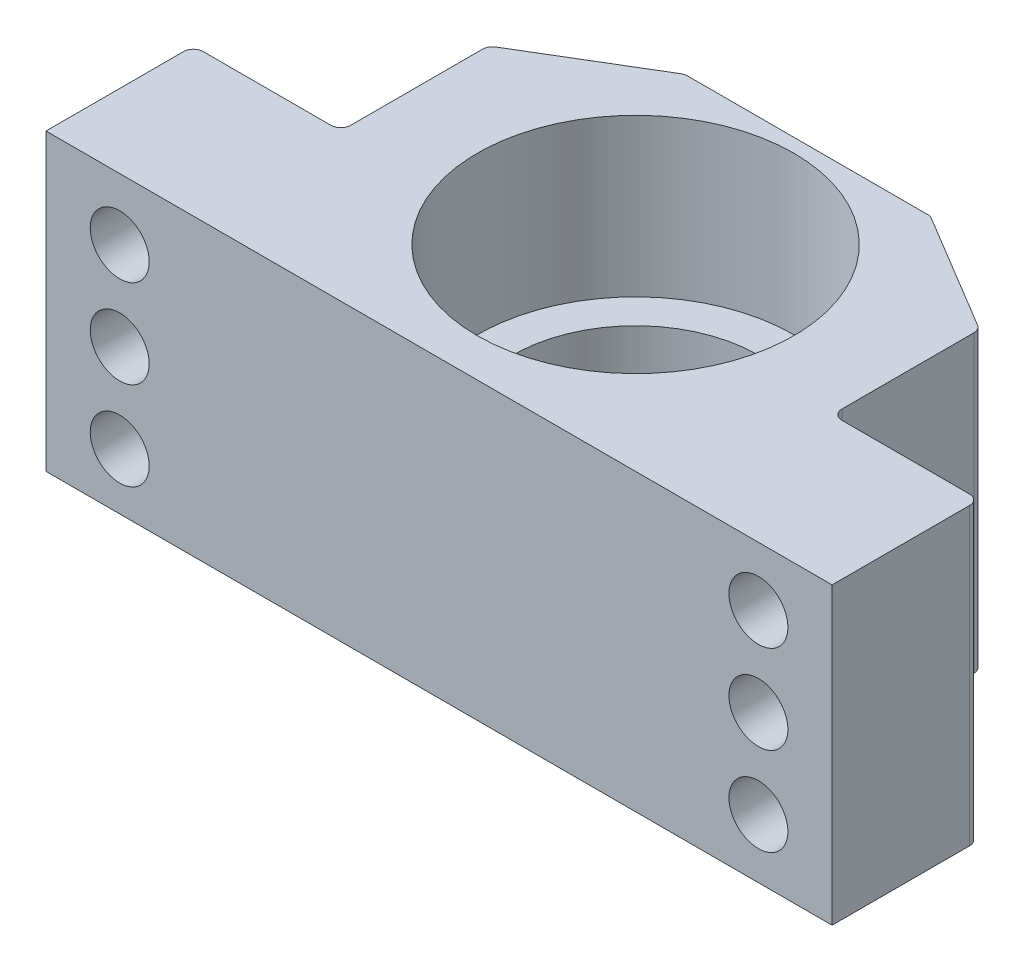
ISO-10303-21;
HEADER;
FILE_DESCRIPTION(('STEP AP214'),'2;1');
FILE_NAME('part.step','',(''),(''),'','','');
FILE_SCHEMA(('AUTOMOTIVE_DESIGN { 1 0 10303 214 1 1 1 1 }'));
ENDSEC;
DATA;
#1=APPLICATION_CONTEXT('core data for automotive mechanical design processes');
#2=APPLICATION_PROTOCOL_DEFINITION('international standard','automotive_design',2000,#1);
#3=PRODUCT_CONTEXT('',#1,'mechanical');
#4=PRODUCT('Part','Part','',(#3));
#5=PRODUCT_RELATED_PRODUCT_CATEGORY('part','',(#4));
#6=PRODUCT_DEFINITION_FORMATION('','',#4);
#7=PRODUCT_DEFINITION_CONTEXT('part definition',#1,'design');
#8=PRODUCT_DEFINITION('design','',#6,#7);
#9=PRODUCT_DEFINITION_SHAPE('','',#8);
#10=(LENGTH_UNIT() NAMED_UNIT(*) SI_UNIT(.MILLI.,.METRE.));
#11=(NAMED_UNIT(*) PLANE_ANGLE_UNIT() SI_UNIT($,.RADIAN.));
#12=(NAMED_UNIT(*) SI_UNIT($,.STERADIAN.) SOLID_ANGLE_UNIT());
#13=UNCERTAINTY_MEASURE_WITH_UNIT(LENGTH_MEASURE(1.E-05),#10,'distance_accuracy_value','');
#14=(GEOMETRIC_REPRESENTATION_CONTEXT(3) GLOBAL_UNCERTAINTY_ASSIGNED_CONTEXT((#13)) GLOBAL_UNIT_ASSIGNED_CONTEXT((#10,
#11,#12)) REPRESENTATION_CONTEXT('',''));
#15=CARTESIAN_POINT('',(0.,0.,0.));
#16=DIRECTION('',(0.,0.,1.));
#17=DIRECTION('',(1.,0.,0.));
#18=AXIS2_PLACEMENT_3D('',#15,#16,#17);
#19=CARTESIAN_POINT('',(0.,30.,0.));
#20=DIRECTION('',(0.,0.,-1.));
#21=DIRECTION('',(-1.,0.,0.));
#22=AXIS2_PLACEMENT_3D('',#19,#20,#21);
#23=PLANE('',#22);
#24=CARTESIAN_POINT('',(-32.5,5.72166377966386,0.));
#25=DIRECTION('',(0.,0.,-1.));
#26=DIRECTION('',(-1.,0.,0.));
#27=AXIS2_PLACEMENT_3D('',#24,#25,#26);
#28=CIRCLE('',#27,3.);
#29=CARTESIAN_POINT('',(-35.5,5.72166377966386,0.));
#30=VERTEX_POINT('',#29);
#31=EDGE_CURVE('E321',#30,#30,#28,.T.);
#32=ORIENTED_EDGE('',*,*,#31,.T.);
#33=EDGE_LOOP('',(#32));
#34=FACE_BOUND('',#33,.T.);
#35=CARTESIAN_POINT('',(-32.5,14.7216637796639,0.));
#36=DIRECTION('',(0.,0.,-1.));
#37=DIRECTION('',(-1.,0.,0.));
#38=AXIS2_PLACEMENT_3D('',#35,#36,#37);
#39=CIRCLE('',#38,3.);
#40=CARTESIAN_POINT('',(-35.5,14.7216637796639,0.));
#41=VERTEX_POINT('',#40);
#42=EDGE_CURVE('E327',#41,#41,#39,.T.);
#43=ORIENTED_EDGE('',*,*,#42,.T.);
#44=EDGE_LOOP('',(#43));
#45=FACE_BOUND('',#44,.T.);
#46=CARTESIAN_POINT('',(-32.5,23.7216637796639,0.));
#47=DIRECTION('',(0.,0.,-1.));
#48=DIRECTION('',(-1.,0.,0.));
#49=AXIS2_PLACEMENT_3D('',#46,#47,#48);
#50=CIRCLE('',#49,3.);
#51=CARTESIAN_POINT('',(-35.5,23.7216637796639,0.));
#52=VERTEX_POINT('',#51);
#53=EDGE_CURVE('E333',#52,#52,#50,.T.);
#54=ORIENTED_EDGE('',*,*,#53,.T.);
#55=EDGE_LOOP('',(#54));
#56=FACE_BOUND('',#55,.T.);
#57=CARTESIAN_POINT('',(32.5,24.,0.));
#58=DIRECTION('',(0.,0.,-1.));
#59=DIRECTION('',(-1.,0.,0.));
#60=AXIS2_PLACEMENT_3D('',#57,#58,#59);
#61=CIRCLE('',#60,3.);
#62=CARTESIAN_POINT('',(29.5,24.,0.));
#63=VERTEX_POINT('',#62);
#64=EDGE_CURVE('E339',#63,#63,#61,.T.);
#65=ORIENTED_EDGE('',*,*,#64,.T.);
#66=EDGE_LOOP('',(#65));
#67=FACE_BOUND('',#66,.T.);
#68=CARTESIAN_POINT('',(32.5,15.,0.));
#69=DIRECTION('',(0.,0.,-1.));
#70=DIRECTION('',(-1.,0.,0.));
#71=AXIS2_PLACEMENT_3D('',#68,#69,#70);
#72=CIRCLE('',#71,3.);
#73=CARTESIAN_POINT('',(29.5,15.,0.));
#74=VERTEX_POINT('',#73);
#75=EDGE_CURVE('E345',#74,#74,#72,.T.);
#76=ORIENTED_EDGE('',*,*,#75,.T.);
#77=EDGE_LOOP('',(#76));
#78=FACE_BOUND('',#77,.T.);
#79=CARTESIAN_POINT('',(32.5,6.,0.));
#80=DIRECTION('',(0.,0.,-1.));
#81=DIRECTION('',(-1.,0.,0.));
#82=AXIS2_PLACEMENT_3D('',#79,#80,#81);
#83=CIRCLE('',#82,3.);
#84=CARTESIAN_POINT('',(29.5,6.,0.));
#85=VERTEX_POINT('',#84);
#86=EDGE_CURVE('E351',#85,#85,#83,.T.);
#87=ORIENTED_EDGE('',*,*,#86,.T.);
#88=EDGE_LOOP('',(#87));
#89=FACE_BOUND('',#88,.T.);
#90=DIRECTION('',(1.,0.,0.));
#91=VECTOR('',#90,1.);
#92=CARTESIAN_POINT('',(0.,0.,0.));
#93=LINE('',#92,#91);
#94=CARTESIAN_POINT('',(-40.,0.,0.));
#95=VERTEX_POINT('',#94);
#96=CARTESIAN_POINT('',(40.,0.,0.));
#97=VERTEX_POINT('',#96);
#98=EDGE_CURVE('E174',#95,#97,#93,.T.);
#99=ORIENTED_EDGE('',*,*,#98,.T.);
#100=DIRECTION('',(0.,-1.,0.));
#101=VECTOR('',#100,1.);
#102=CARTESIAN_POINT('',(40.,30.,0.));
#103=LINE('',#102,#101);
#104=CARTESIAN_POINT('',(40.,30.,0.));
#105=VERTEX_POINT('',#104);
#106=EDGE_CURVE('E172',#105,#97,#103,.T.);
#107=ORIENTED_EDGE('',*,*,#106,.F.);
#108=DIRECTION('',(1.,0.,0.));
#109=VECTOR('',#108,1.);
#110=CARTESIAN_POINT('',(0.,30.,0.));
#111=LINE('',#110,#109);
#112=CARTESIAN_POINT('',(-40.,30.,0.));
#113=VERTEX_POINT('',#112);
#114=EDGE_CURVE('E157',#113,#105,#111,.T.);
#115=ORIENTED_EDGE('',*,*,#114,.F.);
#116=DIRECTION('',(0.,-1.,0.));
#117=VECTOR('',#116,1.);
#118=CARTESIAN_POINT('',(-40.,30.,0.));
#119=LINE('',#118,#117);
#120=EDGE_CURVE('E179',#113,#95,#119,.T.);
#121=ORIENTED_EDGE('',*,*,#120,.T.);
#122=EDGE_LOOP('',(#99,#107,#115,#121));
#123=FACE_BOUND('',#122,.T.);
#124=ADVANCED_FACE('F32',(#34,#45,#56,#67,#78,#89,#123),#23,.F.);
#125=CARTESIAN_POINT('',(40.,30.,0.));
#126=DIRECTION('',(-1.,0.,0.));
#127=DIRECTION('',(0.,0.,1.));
#128=AXIS2_PLACEMENT_3D('',#125,#126,#127);
#129=PLANE('',#128);
#130=DIRECTION('',(0.,0.,-1.));
#131=VECTOR('',#130,1.);
#132=CARTESIAN_POINT('',(40.,0.,0.));
#133=LINE('',#132,#131);
#134=CARTESIAN_POINT('',(40.,0.,-14.));
#135=VERTEX_POINT('',#134);
#136=EDGE_CURVE('E197',#97,#135,#133,.T.);
#137=ORIENTED_EDGE('',*,*,#136,.T.);
#138=DIRECTION('',(0.,-1.,0.));
#139=VECTOR('',#138,1.);
#140=CARTESIAN_POINT('',(40.,30.,-14.));
#141=LINE('',#140,#139);
#142=CARTESIAN_POINT('',(40.,30.,-14.));
#143=VERTEX_POINT('',#142);
#144=EDGE_CURVE('E183',#135,#143,#141,.F.);
#145=ORIENTED_EDGE('',*,*,#144,.T.);
#146=DIRECTION('',(0.,0.,-1.));
#147=VECTOR('',#146,1.);
#148=CARTESIAN_POINT('',(40.,30.,0.));
#149=LINE('',#148,#147);
#150=EDGE_CURVE('E162',#105,#143,#149,.T.);
#151=ORIENTED_EDGE('',*,*,#150,.F.);
#152=ORIENTED_EDGE('',*,*,#106,.T.);
#153=EDGE_LOOP('',(#137,#145,#151,#152));
#154=FACE_BOUND('',#153,.T.);
#155=ADVANCED_FACE('F181',(#154),#129,.F.);
#156=CARTESIAN_POINT('',(40.,30.,-15.));
#157=DIRECTION('',(0.,0.,1.));
#158=DIRECTION('',(1.,0.,0.));
#159=AXIS2_PLACEMENT_3D('',#156,#157,#158);
#160=PLANE('',#159);
#161=CARTESIAN_POINT('',(32.5,24.,-15.));
#162=DIRECTION('',(0.,0.,-1.));
#163=DIRECTION('',(-1.,0.,0.));
#164=AXIS2_PLACEMENT_3D('',#161,#162,#163);
#165=CIRCLE('',#164,3.);
#166=CARTESIAN_POINT('',(29.5,24.,-15.));
#167=VERTEX_POINT('',#166);
#168=EDGE_CURVE('E336',#167,#167,#165,.T.);
#169=ORIENTED_EDGE('',*,*,#168,.F.);
#170=EDGE_LOOP('',(#169));
#171=FACE_BOUND('',#170,.T.);
#172=CARTESIAN_POINT('',(32.5,15.,-15.));
#173=DIRECTION('',(0.,0.,-1.));
#174=DIRECTION('',(-1.,0.,0.));
#175=AXIS2_PLACEMENT_3D('',#172,#173,#174);
#176=CIRCLE('',#175,3.);
#177=CARTESIAN_POINT('',(29.5,15.,-15.));
#178=VERTEX_POINT('',#177);
#179=EDGE_CURVE('E342',#178,#178,#176,.T.);
#180=ORIENTED_EDGE('',*,*,#179,.F.);
#181=EDGE_LOOP('',(#180));
#182=FACE_BOUND('',#181,.T.);
#183=CARTESIAN_POINT('',(32.5,6.,-15.));
#184=DIRECTION('',(0.,0.,-1.));
#185=DIRECTION('',(-1.,0.,0.));
#186=AXIS2_PLACEMENT_3D('',#183,#184,#185);
#187=CIRCLE('',#186,3.);
#188=CARTESIAN_POINT('',(29.5,6.,-15.));
#189=VERTEX_POINT('',#188);
#190=EDGE_CURVE('E348',#189,#189,#187,.T.);
#191=ORIENTED_EDGE('',*,*,#190,.F.);
#192=EDGE_LOOP('',(#191));
#193=FACE_BOUND('',#192,.T.);
#194=DIRECTION('',(-1.,0.,0.));
#195=VECTOR('',#194,1.);
#196=CARTESIAN_POINT('',(40.,30.,-15.));
#197=LINE('',#196,#195);
#198=CARTESIAN_POINT('',(39.,30.,-15.));
#199=VERTEX_POINT('',#198);
#200=CARTESIAN_POINT('',(26.,30.,-15.));
#201=VERTEX_POINT('',#200);
#202=EDGE_CURVE('E184',#199,#201,#197,.T.);
#203=ORIENTED_EDGE('',*,*,#202,.F.);
#204=DIRECTION('',(0.,-1.,0.));
#205=VECTOR('',#204,1.);
#206=CARTESIAN_POINT('',(39.,30.,-15.));
#207=LINE('',#206,#205);
#208=CARTESIAN_POINT('',(39.,0.,-15.));
#209=VERTEX_POINT('',#208);
#210=EDGE_CURVE('E253',#199,#209,#207,.T.);
#211=ORIENTED_EDGE('',*,*,#210,.T.);
#212=DIRECTION('',(-1.,0.,0.));
#213=VECTOR('',#212,1.);
#214=CARTESIAN_POINT('',(40.,0.,-15.));
#215=LINE('',#214,#213);
#216=CARTESIAN_POINT('',(26.,0.,-15.));
#217=VERTEX_POINT('',#216);
#218=EDGE_CURVE('E200',#209,#217,#215,.T.);
#219=ORIENTED_EDGE('',*,*,#218,.T.);
#220=DIRECTION('',(0.,-1.,0.));
#221=VECTOR('',#220,1.);
#222=CARTESIAN_POINT('',(26.,30.,-15.));
#223=LINE('',#222,#221);
#224=EDGE_CURVE('E251',#217,#201,#223,.F.);
#225=ORIENTED_EDGE('',*,*,#224,.T.);
#226=EDGE_LOOP('',(#203,#211,#219,#225));
#227=FACE_BOUND('',#226,.T.);
#228=ADVANCED_FACE('F289',(#171,#182,#193,#227),#160,.F.);
#229=CARTESIAN_POINT('',(25.,30.,-15.));
#230=DIRECTION('',(-1.,0.,0.));
#231=DIRECTION('',(0.,0.,1.));
#232=AXIS2_PLACEMENT_3D('',#229,#230,#231);
#233=PLANE('',#232);
#234=DIRECTION('',(0.,0.,-1.));
#235=VECTOR('',#234,1.);
#236=CARTESIAN_POINT('',(25.,30.,-15.));
#237=LINE('',#236,#235);
#238=CARTESIAN_POINT('',(25.,30.,-16.));
#239=VERTEX_POINT('',#238);
#240=CARTESIAN_POINT('',(25.,30.,-29.4338096210309));
#241=VERTEX_POINT('',#240);
#242=EDGE_CURVE('E186',#239,#241,#237,.T.);
#243=ORIENTED_EDGE('',*,*,#242,.F.);
#244=DIRECTION('',(0.,-1.,0.));
#245=VECTOR('',#244,1.);
#246=CARTESIAN_POINT('',(25.,0.,-16.));
#247=LINE('',#246,#245);
#248=CARTESIAN_POINT('',(25.,0.,-16.));
#249=VERTEX_POINT('',#248);
#250=EDGE_CURVE('E259',#239,#249,#247,.T.);
#251=ORIENTED_EDGE('',*,*,#250,.T.);
#252=DIRECTION('',(0.,0.,-1.));
#253=VECTOR('',#252,1.);
#254=CARTESIAN_POINT('',(25.,0.,-15.));
#255=LINE('',#254,#253);
#256=CARTESIAN_POINT('',(25.,0.,-29.4338096210309));
#257=VERTEX_POINT('',#256);
#258=EDGE_CURVE('E203',#249,#257,#255,.T.);
#259=ORIENTED_EDGE('',*,*,#258,.T.);
#260=DIRECTION('',(0.,1.,0.));
#261=VECTOR('',#260,1.);
#262=CARTESIAN_POINT('',(25.,30.,-29.4338096210309));
#263=LINE('',#262,#261);
#264=EDGE_CURVE('E257',#257,#241,#263,.T.);
#265=ORIENTED_EDGE('',*,*,#264,.T.);
#266=EDGE_LOOP('',(#243,#251,#259,#265));
#267=FACE_BOUND('',#266,.T.);
#268=ADVANCED_FACE('F293',(#267),#233,.F.);
#269=CARTESIAN_POINT('',(-25.,30.,-15.));
#270=DIRECTION('',(1.,0.,0.));
#271=DIRECTION('',(0.,0.,-1.));
#272=AXIS2_PLACEMENT_3D('',#269,#270,#271);
#273=PLANE('',#272);
#274=DIRECTION('',(0.,0.,1.));
#275=VECTOR('',#274,1.);
#276=CARTESIAN_POINT('',(-25.,30.,-15.));
#277=LINE('',#276,#275);
#278=CARTESIAN_POINT('',(-25.,30.,-29.4338096210309));
#279=VERTEX_POINT('',#278);
#280=CARTESIAN_POINT('',(-25.,30.,-16.));
#281=VERTEX_POINT('',#280);
#282=EDGE_CURVE('E191',#279,#281,#277,.T.);
#283=ORIENTED_EDGE('',*,*,#282,.F.);
#284=DIRECTION('',(0.,1.,0.));
#285=VECTOR('',#284,1.);
#286=CARTESIAN_POINT('',(-25.,30.,-29.4338096210309));
#287=LINE('',#286,#285);
#288=CARTESIAN_POINT('',(-25.,0.,-29.4338096210309));
#289=VERTEX_POINT('',#288);
#290=EDGE_CURVE('E277',#279,#289,#287,.F.);
#291=ORIENTED_EDGE('',*,*,#290,.T.);
#292=DIRECTION('',(0.,0.,1.));
#293=VECTOR('',#292,1.);
#294=CARTESIAN_POINT('',(-25.,0.,-15.));
#295=LINE('',#294,#293);
#296=CARTESIAN_POINT('',(-25.,0.,-16.));
#297=VERTEX_POINT('',#296);
#298=EDGE_CURVE('E206',#289,#297,#295,.T.);
#299=ORIENTED_EDGE('',*,*,#298,.T.);
#300=DIRECTION('',(0.,-1.,0.));
#301=VECTOR('',#300,1.);
#302=CARTESIAN_POINT('',(-25.,30.,-16.));
#303=LINE('',#302,#301);
#304=EDGE_CURVE('E215',#297,#281,#303,.F.);
#305=ORIENTED_EDGE('',*,*,#304,.T.);
#306=EDGE_LOOP('',(#283,#291,#299,#305));
#307=FACE_BOUND('',#306,.T.);
#308=ADVANCED_FACE('F435',(#307),#273,.F.);
#309=CARTESIAN_POINT('',(-40.,30.,-15.));
#310=DIRECTION('',(0.,0.,1.));
#311=DIRECTION('',(1.,0.,0.));
#312=AXIS2_PLACEMENT_3D('',#309,#310,#311);
#313=PLANE('',#312);
#314=CARTESIAN_POINT('',(-32.5,5.72166377966386,-15.));
#315=DIRECTION('',(0.,0.,-1.));
#316=DIRECTION('',(-1.,0.,0.));
#317=AXIS2_PLACEMENT_3D('',#314,#315,#316);
#318=CIRCLE('',#317,3.);
#319=CARTESIAN_POINT('',(-35.5,5.72166377966386,-15.));
#320=VERTEX_POINT('',#319);
#321=EDGE_CURVE('E319',#320,#320,#318,.T.);
#322=ORIENTED_EDGE('',*,*,#321,.F.);
#323=EDGE_LOOP('',(#322));
#324=FACE_BOUND('',#323,.T.);
#325=CARTESIAN_POINT('',(-32.5,14.7216637796639,-15.));
#326=DIRECTION('',(0.,0.,-1.));
#327=DIRECTION('',(-1.,0.,0.));
#328=AXIS2_PLACEMENT_3D('',#325,#326,#327);
#329=CIRCLE('',#328,3.);
#330=CARTESIAN_POINT('',(-35.5,14.7216637796639,-15.));
#331=VERTEX_POINT('',#330);
#332=EDGE_CURVE('E324',#331,#331,#329,.T.);
#333=ORIENTED_EDGE('',*,*,#332,.F.);
#334=EDGE_LOOP('',(#333));
#335=FACE_BOUND('',#334,.T.);
#336=CARTESIAN_POINT('',(-32.5,23.7216637796639,-15.));
#337=DIRECTION('',(0.,0.,-1.));
#338=DIRECTION('',(-1.,0.,0.));
#339=AXIS2_PLACEMENT_3D('',#336,#337,#338);
#340=CIRCLE('',#339,3.);
#341=CARTESIAN_POINT('',(-35.5,23.7216637796639,-15.));
#342=VERTEX_POINT('',#341);
#343=EDGE_CURVE('E330',#342,#342,#340,.T.);
#344=ORIENTED_EDGE('',*,*,#343,.F.);
#345=EDGE_LOOP('',(#344));
#346=FACE_BOUND('',#345,.T.);
#347=DIRECTION('',(-1.,0.,0.));
#348=VECTOR('',#347,1.);
#349=CARTESIAN_POINT('',(-40.,0.,-15.));
#350=LINE('',#349,#348);
#351=CARTESIAN_POINT('',(-26.,0.,-15.));
#352=VERTEX_POINT('',#351);
#353=CARTESIAN_POINT('',(-39.,0.,-15.));
#354=VERTEX_POINT('',#353);
#355=EDGE_CURVE('E208',#352,#354,#350,.T.);
#356=ORIENTED_EDGE('',*,*,#355,.T.);
#357=DIRECTION('',(0.,-1.,0.));
#358=VECTOR('',#357,1.);
#359=CARTESIAN_POINT('',(-39.,30.,-15.));
#360=LINE('',#359,#358);
#361=CARTESIAN_POINT('',(-39.,30.,-15.));
#362=VERTEX_POINT('',#361);
#363=EDGE_CURVE('E238',#354,#362,#360,.F.);
#364=ORIENTED_EDGE('',*,*,#363,.T.);
#365=DIRECTION('',(-1.,0.,0.));
#366=VECTOR('',#365,1.);
#367=CARTESIAN_POINT('',(-40.,30.,-15.));
#368=LINE('',#367,#366);
#369=CARTESIAN_POINT('',(-26.,30.,-15.));
#370=VERTEX_POINT('',#369);
#371=EDGE_CURVE('E193',#370,#362,#368,.T.);
#372=ORIENTED_EDGE('',*,*,#371,.F.);
#373=DIRECTION('',(0.,-1.,0.));
#374=VECTOR('',#373,1.);
#375=CARTESIAN_POINT('',(-26.,0.,-15.));
#376=LINE('',#375,#374);
#377=EDGE_CURVE('E178',#370,#352,#376,.T.);
#378=ORIENTED_EDGE('',*,*,#377,.T.);
#379=EDGE_LOOP('',(#356,#364,#372,#378));
#380=FACE_BOUND('',#379,.T.);
#381=ADVANCED_FACE('F377',(#324,#335,#346,#380),#313,.F.);
#382=CARTESIAN_POINT('',(-40.,30.,0.));
#383=DIRECTION('',(1.,0.,0.));
#384=DIRECTION('',(0.,0.,-1.));
#385=AXIS2_PLACEMENT_3D('',#382,#383,#384);
#386=PLANE('',#385);
#387=DIRECTION('',(0.,0.,1.));
#388=VECTOR('',#387,1.);
#389=CARTESIAN_POINT('',(-40.,30.,0.));
#390=LINE('',#389,#388);
#391=CARTESIAN_POINT('',(-40.,30.,-14.));
#392=VERTEX_POINT('',#391);
#393=EDGE_CURVE('E165',#392,#113,#390,.T.);
#394=ORIENTED_EDGE('',*,*,#393,.F.);
#395=DIRECTION('',(0.,-1.,0.));
#396=VECTOR('',#395,1.);
#397=CARTESIAN_POINT('',(-40.,30.,-14.));
#398=LINE('',#397,#396);
#399=CARTESIAN_POINT('',(-40.,0.,-14.));
#400=VERTEX_POINT('',#399);
#401=EDGE_CURVE('E223',#392,#400,#398,.T.);
#402=ORIENTED_EDGE('',*,*,#401,.T.);
#403=DIRECTION('',(0.,0.,1.));
#404=VECTOR('',#403,1.);
#405=CARTESIAN_POINT('',(-40.,0.,0.));
#406=LINE('',#405,#404);
#407=EDGE_CURVE('E169',#400,#95,#406,.T.);
#408=ORIENTED_EDGE('',*,*,#407,.T.);
#409=ORIENTED_EDGE('',*,*,#120,.F.);
#410=EDGE_LOOP('',(#394,#402,#408,#409));
#411=FACE_BOUND('',#410,.T.);
#412=ADVANCED_FACE('F370',(#411),#386,.F.);
#413=CARTESIAN_POINT('',(0.,30.,0.));
#414=DIRECTION('',(0.,-1.,0.));
#415=DIRECTION('',(0.,0.,-1.));
#416=AXIS2_PLACEMENT_3D('',#413,#414,#415);
#417=PLANE('',#416);
#418=CARTESIAN_POINT('',(0.,30.,-20.));
#419=DIRECTION('',(0.,1.,0.));
#420=DIRECTION('',(0.,0.,1.));
#421=AXIS2_PLACEMENT_3D('',#418,#419,#420);
#422=CIRCLE('',#421,16.1);
#423=CARTESIAN_POINT('',(0.,30.,-3.89999999999999));
#424=VERTEX_POINT('',#423);
#425=EDGE_CURVE('E360',#424,#424,#422,.T.);
#426=ORIENTED_EDGE('',*,*,#425,.F.);
#427=EDGE_LOOP('',(#426));
#428=FACE_BOUND('',#427,.T.);
#429=ORIENTED_EDGE('',*,*,#371,.T.);
#430=CARTESIAN_POINT('',(-39.,30.,-14.));
#431=DIRECTION('',(0.,-1.,0.));
#432=DIRECTION('',(0.,0.,-1.));
#433=AXIS2_PLACEMENT_3D('',#430,#431,#432);
#434=CIRCLE('',#433,1.);
#435=EDGE_CURVE('E249',#362,#392,#434,.F.);
#436=ORIENTED_EDGE('',*,*,#435,.T.);
#437=ORIENTED_EDGE('',*,*,#393,.T.);
#438=ORIENTED_EDGE('',*,*,#114,.T.);
#439=ORIENTED_EDGE('',*,*,#150,.T.);
#440=CARTESIAN_POINT('',(39.,30.,-14.));
#441=DIRECTION('',(0.,-1.,0.));
#442=DIRECTION('',(0.,0.,-1.));
#443=AXIS2_PLACEMENT_3D('',#440,#441,#442);
#444=CIRCLE('',#443,1.);
#445=EDGE_CURVE('E247',#143,#199,#444,.F.);
#446=ORIENTED_EDGE('',*,*,#445,.T.);
#447=ORIENTED_EDGE('',*,*,#202,.T.);
#448=CARTESIAN_POINT('',(26.,30.,-16.));
#449=DIRECTION('',(0.,-1.,0.));
#450=DIRECTION('',(0.,0.,-1.));
#451=AXIS2_PLACEMENT_3D('',#448,#449,#450);
#452=CIRCLE('',#451,1.);
#453=EDGE_CURVE('E11',#201,#239,#452,.T.);
#454=ORIENTED_EDGE('',*,*,#453,.T.);
#455=ORIENTED_EDGE('',*,*,#242,.T.);
#456=CARTESIAN_POINT('',(24.,30.,-29.4338096210309));
#457=DIRECTION('',(0.,-1.,0.));
#458=DIRECTION('',(0.,0.,-1.));
#459=AXIS2_PLACEMENT_3D('',#456,#457,#458);
#460=CIRCLE('',#459,1.);
#461=CARTESIAN_POINT('',(24.5144957554275,30.,-30.2913025467435));
#462=VERTEX_POINT('',#461);
#463=EDGE_CURVE('E47',#241,#462,#460,.F.);
#464=ORIENTED_EDGE('',*,*,#463,.T.);
#465=DIRECTION('',(0.857492925712544,0.,0.514495755427526));
#466=VECTOR('',#465,1.);
#467=CARTESIAN_POINT('',(25.,30.,-30.));
#468=LINE('',#467,#466);
#469=CARTESIAN_POINT('',(12.7375117904791,30.,-37.3574929257125));
#470=VERTEX_POINT('',#469);
#471=EDGE_CURVE('E296',#470,#462,#468,.T.);
#472=ORIENTED_EDGE('',*,*,#471,.F.);
#473=CARTESIAN_POINT('',(12.2230160350516,30.,-36.5));
#474=DIRECTION('',(0.,-1.,0.));
#475=DIRECTION('',(0.,0.,-1.));
#476=AXIS2_PLACEMENT_3D('',#473,#474,#475);
#477=CIRCLE('',#476,1.);
#478=CARTESIAN_POINT('',(12.2230160350516,30.,-37.5));
#479=VERTEX_POINT('',#478);
#480=EDGE_CURVE('E244',#470,#479,#477,.F.);
#481=ORIENTED_EDGE('',*,*,#480,.T.);
#482=DIRECTION('',(1.,0.,0.));
#483=VECTOR('',#482,1.);
#484=CARTESIAN_POINT('',(-12.5,30.,-37.5));
#485=LINE('',#484,#483);
#486=CARTESIAN_POINT('',(-12.2230160350516,30.,-37.5));
#487=VERTEX_POINT('',#486);
#488=EDGE_CURVE('E315',#487,#479,#485,.T.);
#489=ORIENTED_EDGE('',*,*,#488,.F.);
#490=CARTESIAN_POINT('',(-12.2230160350516,30.,-36.5));
#491=DIRECTION('',(0.,-1.,0.));
#492=DIRECTION('',(0.,0.,-1.));
#493=AXIS2_PLACEMENT_3D('',#490,#491,#492);
#494=CIRCLE('',#493,1.);
#495=CARTESIAN_POINT('',(-12.7375117904791,30.,-37.3574929257125));
#496=VERTEX_POINT('',#495);
#497=EDGE_CURVE('E242',#487,#496,#494,.F.);
#498=ORIENTED_EDGE('',*,*,#497,.T.);
#499=DIRECTION('',(0.857492925712544,0.,-0.514495755427526));
#500=VECTOR('',#499,1.);
#501=CARTESIAN_POINT('',(0.,30.,-45.));
#502=LINE('',#501,#500);
#503=CARTESIAN_POINT('',(-24.5144957554275,30.,-30.2913025467435));
#504=VERTEX_POINT('',#503);
#505=EDGE_CURVE('E309',#504,#496,#502,.T.);
#506=ORIENTED_EDGE('',*,*,#505,.F.);
#507=CARTESIAN_POINT('',(-24.,30.,-29.4338096210309));
#508=DIRECTION('',(0.,-1.,0.));
#509=DIRECTION('',(0.,0.,-1.));
#510=AXIS2_PLACEMENT_3D('',#507,#508,#509);
#511=CIRCLE('',#510,1.);
#512=EDGE_CURVE('E240',#504,#279,#511,.F.);
#513=ORIENTED_EDGE('',*,*,#512,.T.);
#514=ORIENTED_EDGE('',*,*,#282,.T.);
#515=CARTESIAN_POINT('',(-26.,30.,-16.));
#516=DIRECTION('',(0.,-1.,0.));
#517=DIRECTION('',(0.,0.,-1.));
#518=AXIS2_PLACEMENT_3D('',#515,#516,#517);
#519=CIRCLE('',#518,1.);
#520=EDGE_CURVE('E221',#281,#370,#519,.T.);
#521=ORIENTED_EDGE('',*,*,#520,.T.);
#522=EDGE_LOOP('',(#429,#436,#437,#438,#439,#446,#447,#454,#455,#464,#472,#481,#489,#498,#506,
#513,#514,#521));
#523=FACE_BOUND('',#522,.T.);
#524=ADVANCED_FACE('F160',(#428,#523),#417,.F.);
#525=CARTESIAN_POINT('',(0.,0.,0.));
#526=DIRECTION('',(0.,-1.,0.));
#527=DIRECTION('',(0.,0.,-1.));
#528=AXIS2_PLACEMENT_3D('',#525,#526,#527);
#529=PLANE('',#528);
#530=ORIENTED_EDGE('',*,*,#407,.F.);
#531=CARTESIAN_POINT('',(-39.,0.,-14.));
#532=DIRECTION('',(0.,-1.,0.));
#533=DIRECTION('',(0.,0.,-1.));
#534=AXIS2_PLACEMENT_3D('',#531,#532,#533);
#535=CIRCLE('',#534,1.);
#536=EDGE_CURVE('E236',#400,#354,#535,.T.);
#537=ORIENTED_EDGE('',*,*,#536,.T.);
#538=ORIENTED_EDGE('',*,*,#355,.F.);
#539=CARTESIAN_POINT('',(-26.,0.,-16.));
#540=DIRECTION('',(0.,-1.,0.));
#541=DIRECTION('',(0.,0.,-1.));
#542=AXIS2_PLACEMENT_3D('',#539,#540,#541);
#543=CIRCLE('',#542,1.);
#544=EDGE_CURVE('E218',#352,#297,#543,.F.);
#545=ORIENTED_EDGE('',*,*,#544,.T.);
#546=ORIENTED_EDGE('',*,*,#298,.F.);
#547=CARTESIAN_POINT('',(-24.,0.,-29.4338096210309));
#548=DIRECTION('',(0.,-1.,0.));
#549=DIRECTION('',(0.,0.,-1.));
#550=AXIS2_PLACEMENT_3D('',#547,#548,#549);
#551=CIRCLE('',#550,1.);
#552=CARTESIAN_POINT('',(-24.5144957554275,0.,-30.2913025467435));
#553=VERTEX_POINT('',#552);
#554=EDGE_CURVE('E226',#289,#553,#551,.T.);
#555=ORIENTED_EDGE('',*,*,#554,.T.);
#556=DIRECTION('',(0.857492925712544,0.,-0.514495755427526));
#557=VECTOR('',#556,1.);
#558=CARTESIAN_POINT('',(0.,0.,-45.));
#559=LINE('',#558,#557);
#560=CARTESIAN_POINT('',(-12.7375117904791,0.,-37.3574929257125));
#561=VERTEX_POINT('',#560);
#562=EDGE_CURVE('E312',#553,#561,#559,.T.);
#563=ORIENTED_EDGE('',*,*,#562,.T.);
#564=CARTESIAN_POINT('',(-12.2230160350516,0.,-36.5));
#565=DIRECTION('',(0.,-1.,0.));
#566=DIRECTION('',(0.,0.,-1.));
#567=AXIS2_PLACEMENT_3D('',#564,#565,#566);
#568=CIRCLE('',#567,1.);
#569=CARTESIAN_POINT('',(-12.2230160350516,0.,-37.5));
#570=VERTEX_POINT('',#569);
#571=EDGE_CURVE('E228',#561,#570,#568,.T.);
#572=ORIENTED_EDGE('',*,*,#571,.T.);
#573=DIRECTION('',(1.,0.,0.));
#574=VECTOR('',#573,1.);
#575=CARTESIAN_POINT('',(-12.5,0.,-37.5));
#576=LINE('',#575,#574);
#577=CARTESIAN_POINT('',(12.2230160350516,0.,-37.5));
#578=VERTEX_POINT('',#577);
#579=EDGE_CURVE('E303',#570,#578,#576,.T.);
#580=ORIENTED_EDGE('',*,*,#579,.T.);
#581=CARTESIAN_POINT('',(12.2230160350516,0.,-36.5));
#582=DIRECTION('',(0.,-1.,0.));
#583=DIRECTION('',(0.,0.,-1.));
#584=AXIS2_PLACEMENT_3D('',#581,#582,#583);
#585=CIRCLE('',#584,1.);
#586=CARTESIAN_POINT('',(12.7375117904791,0.,-37.3574929257125));
#587=VERTEX_POINT('',#586);
#588=EDGE_CURVE('E230',#578,#587,#585,.T.);
#589=ORIENTED_EDGE('',*,*,#588,.T.);
#590=DIRECTION('',(0.857492925712544,0.,0.514495755427526));
#591=VECTOR('',#590,1.);
#592=CARTESIAN_POINT('',(25.,0.,-30.));
#593=LINE('',#592,#591);
#594=CARTESIAN_POINT('',(24.5144957554275,0.,-30.2913025467435));
#595=VERTEX_POINT('',#594);
#596=EDGE_CURVE('E302',#587,#595,#593,.T.);
#597=ORIENTED_EDGE('',*,*,#596,.T.);
#598=CARTESIAN_POINT('',(24.,0.,-29.4338096210309));
#599=DIRECTION('',(0.,-1.,0.));
#600=DIRECTION('',(0.,0.,-1.));
#601=AXIS2_PLACEMENT_3D('',#598,#599,#600);
#602=CIRCLE('',#601,1.);
#603=EDGE_CURVE('E232',#595,#257,#602,.T.);
#604=ORIENTED_EDGE('',*,*,#603,.T.);
#605=ORIENTED_EDGE('',*,*,#258,.F.);
#606=CARTESIAN_POINT('',(26.,0.,-16.));
#607=DIRECTION('',(0.,-1.,0.));
#608=DIRECTION('',(0.,0.,-1.));
#609=AXIS2_PLACEMENT_3D('',#606,#607,#608);
#610=CIRCLE('',#609,1.);
#611=EDGE_CURVE('E40',#249,#217,#610,.F.);
#612=ORIENTED_EDGE('',*,*,#611,.T.);
#613=ORIENTED_EDGE('',*,*,#218,.F.);
#614=CARTESIAN_POINT('',(39.,0.,-14.));
#615=DIRECTION('',(0.,-1.,0.));
#616=DIRECTION('',(0.,0.,-1.));
#617=AXIS2_PLACEMENT_3D('',#614,#615,#616);
#618=CIRCLE('',#617,1.);
#619=EDGE_CURVE('E234',#209,#135,#618,.T.);
#620=ORIENTED_EDGE('',*,*,#619,.T.);
#621=ORIENTED_EDGE('',*,*,#136,.F.);
#622=ORIENTED_EDGE('',*,*,#98,.F.);
#623=EDGE_LOOP('',(#530,#537,#538,#545,#546,#555,#563,#572,#580,#589,#597,#604,#605,#612,#613,
#620,#621,#622));
#624=FACE_BOUND('',#623,.T.);
#625=CARTESIAN_POINT('',(0.,0.,-20.));
#626=DIRECTION('',(0.,-1.,0.));
#627=DIRECTION('',(0.,0.,-1.));
#628=AXIS2_PLACEMENT_3D('',#625,#626,#627);
#629=CIRCLE('',#628,12.5);
#630=CARTESIAN_POINT('',(0.,0.,-32.5));
#631=VERTEX_POINT('',#630);
#632=EDGE_CURVE('E354',#631,#631,#629,.T.);
#633=ORIENTED_EDGE('',*,*,#632,.F.);
#634=EDGE_LOOP('',(#633));
#635=FACE_BOUND('',#634,.T.);
#636=ADVANCED_FACE('F282',(#624,#635),#529,.T.);
#637=CARTESIAN_POINT('',(0.,14.,-20.));
#638=DIRECTION('',(0.,1.,0.));
#639=DIRECTION('',(0.,0.,1.));
#640=AXIS2_PLACEMENT_3D('',#637,#638,#639);
#641=CYLINDRICAL_SURFACE('',#640,16.1);
#642=CARTESIAN_POINT('',(0.,14.,-20.));
#643=DIRECTION('',(0.,1.,0.));
#644=DIRECTION('',(0.,0.,1.));
#645=AXIS2_PLACEMENT_3D('',#642,#643,#644);
#646=CIRCLE('',#645,16.1);
#647=CARTESIAN_POINT('',(0.,14.,-3.89999999999999));
#648=VERTEX_POINT('',#647);
#649=EDGE_CURVE('E198',#648,#648,#646,.T.);
#650=ORIENTED_EDGE('',*,*,#649,.F.);
#651=EDGE_LOOP('',(#650));
#652=FACE_BOUND('',#651,.T.);
#653=ORIENTED_EDGE('',*,*,#425,.T.);
#654=EDGE_LOOP('',(#653));
#655=FACE_BOUND('',#654,.T.);
#656=ADVANCED_FACE('F367',(#652,#655),#641,.F.);
#657=CARTESIAN_POINT('',(0.,14.,-20.));
#658=DIRECTION('',(0.,1.,0.));
#659=DIRECTION('',(0.,0.,1.));
#660=AXIS2_PLACEMENT_3D('',#657,#658,#659);
#661=PLANE('',#660);
#662=CARTESIAN_POINT('',(0.,14.,-20.));
#663=DIRECTION('',(0.,-1.,0.));
#664=DIRECTION('',(0.,0.,-1.));
#665=AXIS2_PLACEMENT_3D('',#662,#663,#664);
#666=CIRCLE('',#665,12.5);
#667=CARTESIAN_POINT('',(0.,14.,-32.5));
#668=VERTEX_POINT('',#667);
#669=EDGE_CURVE('E357',#668,#668,#666,.T.);
#670=ORIENTED_EDGE('',*,*,#669,.T.);
#671=EDGE_LOOP('',(#670));
#672=FACE_BOUND('',#671,.T.);
#673=ORIENTED_EDGE('',*,*,#649,.T.);
#674=EDGE_LOOP('',(#673));
#675=FACE_BOUND('',#674,.T.);
#676=ADVANCED_FACE('F480',(#672,#675),#661,.T.);
#677=CARTESIAN_POINT('',(0.,14.,-20.));
#678=DIRECTION('',(0.,-1.,0.));
#679=DIRECTION('',(0.,0.,-1.));
#680=AXIS2_PLACEMENT_3D('',#677,#678,#679);
#681=CYLINDRICAL_SURFACE('',#680,12.5);
#682=ORIENTED_EDGE('',*,*,#669,.F.);
#683=EDGE_LOOP('',(#682));
#684=FACE_BOUND('',#683,.T.);
#685=ORIENTED_EDGE('',*,*,#632,.T.);
#686=EDGE_LOOP('',(#685));
#687=FACE_BOUND('',#686,.T.);
#688=ADVANCED_FACE('F470',(#684,#687),#681,.F.);
#689=CARTESIAN_POINT('',(32.5,6.,0.));
#690=DIRECTION('',(0.,0.,-1.));
#691=DIRECTION('',(-1.,0.,0.));
#692=AXIS2_PLACEMENT_3D('',#689,#690,#691);
#693=CYLINDRICAL_SURFACE('',#692,3.);
#694=ORIENTED_EDGE('',*,*,#86,.F.);
#695=EDGE_LOOP('',(#694));
#696=FACE_BOUND('',#695,.T.);
#697=ORIENTED_EDGE('',*,*,#190,.T.);
#698=EDGE_LOOP('',(#697));
#699=FACE_BOUND('',#698,.T.);
#700=ADVANCED_FACE('F467',(#696,#699),#693,.F.);
#701=CARTESIAN_POINT('',(32.5,15.,0.));
#702=DIRECTION('',(0.,0.,-1.));
#703=DIRECTION('',(-1.,0.,0.));
#704=AXIS2_PLACEMENT_3D('',#701,#702,#703);
#705=CYLINDRICAL_SURFACE('',#704,3.);
#706=ORIENTED_EDGE('',*,*,#75,.F.);
#707=EDGE_LOOP('',(#706));
#708=FACE_BOUND('',#707,.T.);
#709=ORIENTED_EDGE('',*,*,#179,.T.);
#710=EDGE_LOOP('',(#709));
#711=FACE_BOUND('',#710,.T.);
#712=ADVANCED_FACE('F469',(#708,#711),#705,.F.);
#713=CARTESIAN_POINT('',(32.5,24.,0.));
#714=DIRECTION('',(0.,0.,-1.));
#715=DIRECTION('',(-1.,0.,0.));
#716=AXIS2_PLACEMENT_3D('',#713,#714,#715);
#717=CYLINDRICAL_SURFACE('',#716,3.);
#718=ORIENTED_EDGE('',*,*,#64,.F.);
#719=EDGE_LOOP('',(#718));
#720=FACE_BOUND('',#719,.T.);
#721=ORIENTED_EDGE('',*,*,#168,.T.);
#722=EDGE_LOOP('',(#721));
#723=FACE_BOUND('',#722,.T.);
#724=ADVANCED_FACE('F477',(#720,#723),#717,.F.);
#725=CARTESIAN_POINT('',(-32.5,23.7216637796639,0.));
#726=DIRECTION('',(0.,0.,-1.));
#727=DIRECTION('',(-1.,0.,0.));
#728=AXIS2_PLACEMENT_3D('',#725,#726,#727);
#729=CYLINDRICAL_SURFACE('',#728,3.);
#730=ORIENTED_EDGE('',*,*,#53,.F.);
#731=EDGE_LOOP('',(#730));
#732=FACE_BOUND('',#731,.T.);
#733=ORIENTED_EDGE('',*,*,#343,.T.);
#734=EDGE_LOOP('',(#733));
#735=FACE_BOUND('',#734,.T.);
#736=ADVANCED_FACE('F522',(#732,#735),#729,.F.);
#737=CARTESIAN_POINT('',(-32.5,14.7216637796639,0.));
#738=DIRECTION('',(0.,0.,-1.));
#739=DIRECTION('',(-1.,0.,0.));
#740=AXIS2_PLACEMENT_3D('',#737,#738,#739);
#741=CYLINDRICAL_SURFACE('',#740,3.);
#742=ORIENTED_EDGE('',*,*,#42,.F.);
#743=EDGE_LOOP('',(#742));
#744=FACE_BOUND('',#743,.T.);
#745=ORIENTED_EDGE('',*,*,#332,.T.);
#746=EDGE_LOOP('',(#745));
#747=FACE_BOUND('',#746,.T.);
#748=ADVANCED_FACE('F538',(#744,#747),#741,.F.);
#749=CARTESIAN_POINT('',(-32.5,5.72166377966386,0.));
#750=DIRECTION('',(0.,0.,-1.));
#751=DIRECTION('',(-1.,0.,0.));
#752=AXIS2_PLACEMENT_3D('',#749,#750,#751);
#753=CYLINDRICAL_SURFACE('',#752,3.);
#754=ORIENTED_EDGE('',*,*,#31,.F.);
#755=EDGE_LOOP('',(#754));
#756=FACE_BOUND('',#755,.T.);
#757=ORIENTED_EDGE('',*,*,#321,.T.);
#758=EDGE_LOOP('',(#757));
#759=FACE_BOUND('',#758,.T.);
#760=ADVANCED_FACE('F548',(#756,#759),#753,.F.);
#761=CARTESIAN_POINT('',(0.,0.,-45.));
#762=DIRECTION('',(0.514495755427526,0.,0.857492925712544));
#763=DIRECTION('',(0.857492925712544,0.,-0.514495755427526));
#764=AXIS2_PLACEMENT_3D('',#761,#762,#763);
#765=PLANE('',#764);
#766=ORIENTED_EDGE('',*,*,#505,.T.);
#767=DIRECTION('',(0.,1.,0.));
#768=VECTOR('',#767,1.);
#769=CARTESIAN_POINT('',(-12.7375117904791,0.,-37.3574929257125));
#770=LINE('',#769,#768);
#771=EDGE_CURVE('E275',#496,#561,#770,.F.);
#772=ORIENTED_EDGE('',*,*,#771,.T.);
#773=ORIENTED_EDGE('',*,*,#562,.F.);
#774=DIRECTION('',(0.,1.,0.));
#775=VECTOR('',#774,1.);
#776=CARTESIAN_POINT('',(-24.5144957554275,0.,-30.2913025467435));
#777=LINE('',#776,#775);
#778=EDGE_CURVE('E272',#553,#504,#777,.T.);
#779=ORIENTED_EDGE('',*,*,#778,.T.);
#780=EDGE_LOOP('',(#766,#772,#773,#779));
#781=FACE_BOUND('',#780,.T.);
#782=ADVANCED_FACE('F429',(#781),#765,.F.);
#783=CARTESIAN_POINT('',(25.,0.,-30.));
#784=DIRECTION('',(-0.514495755427526,0.,0.857492925712544));
#785=DIRECTION('',(0.857492925712544,0.,0.514495755427526));
#786=AXIS2_PLACEMENT_3D('',#783,#784,#785);
#787=PLANE('',#786);
#788=ORIENTED_EDGE('',*,*,#471,.T.);
#789=DIRECTION('',(0.,1.,0.));
#790=VECTOR('',#789,1.);
#791=CARTESIAN_POINT('',(24.5144957554275,0.,-30.2913025467435));
#792=LINE('',#791,#790);
#793=EDGE_CURVE('E265',#462,#595,#792,.F.);
#794=ORIENTED_EDGE('',*,*,#793,.T.);
#795=ORIENTED_EDGE('',*,*,#596,.F.);
#796=DIRECTION('',(0.,1.,0.));
#797=VECTOR('',#796,1.);
#798=CARTESIAN_POINT('',(12.7375117904791,0.,-37.3574929257125));
#799=LINE('',#798,#797);
#800=EDGE_CURVE('E262',#587,#470,#799,.T.);
#801=ORIENTED_EDGE('',*,*,#800,.T.);
#802=EDGE_LOOP('',(#788,#794,#795,#801));
#803=FACE_BOUND('',#802,.T.);
#804=ADVANCED_FACE('F298',(#803),#787,.F.);
#805=CARTESIAN_POINT('',(-12.5,0.,-37.5));
#806=DIRECTION('',(0.,0.,1.));
#807=DIRECTION('',(1.,0.,0.));
#808=AXIS2_PLACEMENT_3D('',#805,#806,#807);
#809=PLANE('',#808);
#810=ORIENTED_EDGE('',*,*,#488,.T.);
#811=DIRECTION('',(0.,1.,0.));
#812=VECTOR('',#811,1.);
#813=CARTESIAN_POINT('',(12.2230160350516,0.,-37.5));
#814=LINE('',#813,#812);
#815=EDGE_CURVE('E270',#479,#578,#814,.F.);
#816=ORIENTED_EDGE('',*,*,#815,.T.);
#817=ORIENTED_EDGE('',*,*,#579,.F.);
#818=DIRECTION('',(0.,1.,0.));
#819=VECTOR('',#818,1.);
#820=CARTESIAN_POINT('',(-12.2230160350516,0.,-37.5));
#821=LINE('',#820,#819);
#822=EDGE_CURVE('E267',#570,#487,#821,.T.);
#823=ORIENTED_EDGE('',*,*,#822,.T.);
#824=EDGE_LOOP('',(#810,#816,#817,#823));
#825=FACE_BOUND('',#824,.T.);
#826=ADVANCED_FACE('F395',(#825),#809,.F.);
#827=CARTESIAN_POINT('',(-26.,30.,-16.));
#828=DIRECTION('',(0.,1.,0.));
#829=DIRECTION('',(0.,0.,1.));
#830=AXIS2_PLACEMENT_3D('',#827,#828,#829);
#831=CYLINDRICAL_SURFACE('',#830,1.);
#832=ORIENTED_EDGE('',*,*,#520,.F.);
#833=ORIENTED_EDGE('',*,*,#304,.F.);
#834=ORIENTED_EDGE('',*,*,#544,.F.);
#835=ORIENTED_EDGE('',*,*,#377,.F.);
#836=EDGE_LOOP('',(#832,#833,#834,#835));
#837=FACE_BOUND('',#836,.T.);
#838=ADVANCED_FACE('F391',(#837),#831,.F.);
#839=CARTESIAN_POINT('',(-39.,30.,-14.));
#840=DIRECTION('',(0.,-1.,0.));
#841=DIRECTION('',(0.,0.,-1.));
#842=AXIS2_PLACEMENT_3D('',#839,#840,#841);
#843=CYLINDRICAL_SURFACE('',#842,1.);
#844=ORIENTED_EDGE('',*,*,#435,.F.);
#845=ORIENTED_EDGE('',*,*,#363,.F.);
#846=ORIENTED_EDGE('',*,*,#536,.F.);
#847=ORIENTED_EDGE('',*,*,#401,.F.);
#848=EDGE_LOOP('',(#844,#845,#846,#847));
#849=FACE_BOUND('',#848,.T.);
#850=ADVANCED_FACE('F394',(#849),#843,.T.);
#851=CARTESIAN_POINT('',(39.,30.,-14.));
#852=DIRECTION('',(0.,-1.,0.));
#853=DIRECTION('',(0.,0.,-1.));
#854=AXIS2_PLACEMENT_3D('',#851,#852,#853);
#855=CYLINDRICAL_SURFACE('',#854,1.);
#856=ORIENTED_EDGE('',*,*,#445,.F.);
#857=ORIENTED_EDGE('',*,*,#144,.F.);
#858=ORIENTED_EDGE('',*,*,#619,.F.);
#859=ORIENTED_EDGE('',*,*,#210,.F.);
#860=EDGE_LOOP('',(#856,#857,#858,#859));
#861=FACE_BOUND('',#860,.T.);
#862=ADVANCED_FACE('F399',(#861),#855,.T.);
#863=CARTESIAN_POINT('',(26.,30.,-16.));
#864=DIRECTION('',(0.,1.,0.));
#865=DIRECTION('',(0.,0.,1.));
#866=AXIS2_PLACEMENT_3D('',#863,#864,#865);
#867=CYLINDRICAL_SURFACE('',#866,1.);
#868=ORIENTED_EDGE('',*,*,#453,.F.);
#869=ORIENTED_EDGE('',*,*,#224,.F.);
#870=ORIENTED_EDGE('',*,*,#611,.F.);
#871=ORIENTED_EDGE('',*,*,#250,.F.);
#872=EDGE_LOOP('',(#868,#869,#870,#871));
#873=FACE_BOUND('',#872,.T.);
#874=ADVANCED_FACE('F291',(#873),#867,.F.);
#875=CARTESIAN_POINT('',(24.,30.,-29.4338096210309));
#876=DIRECTION('',(0.,1.,0.));
#877=DIRECTION('',(0.,0.,1.));
#878=AXIS2_PLACEMENT_3D('',#875,#876,#877);
#879=CYLINDRICAL_SURFACE('',#878,1.);
#880=ORIENTED_EDGE('',*,*,#603,.F.);
#881=ORIENTED_EDGE('',*,*,#793,.F.);
#882=ORIENTED_EDGE('',*,*,#463,.F.);
#883=ORIENTED_EDGE('',*,*,#264,.F.);
#884=EDGE_LOOP('',(#880,#881,#882,#883));
#885=FACE_BOUND('',#884,.T.);
#886=ADVANCED_FACE('F306',(#885),#879,.T.);
#887=CARTESIAN_POINT('',(12.2230160350516,0.,-36.5));
#888=DIRECTION('',(0.,1.,0.));
#889=DIRECTION('',(0.,0.,1.));
#890=AXIS2_PLACEMENT_3D('',#887,#888,#889);
#891=CYLINDRICAL_SURFACE('',#890,1.);
#892=ORIENTED_EDGE('',*,*,#588,.F.);
#893=ORIENTED_EDGE('',*,*,#815,.F.);
#894=ORIENTED_EDGE('',*,*,#480,.F.);
#895=ORIENTED_EDGE('',*,*,#800,.F.);
#896=EDGE_LOOP('',(#892,#893,#894,#895));
#897=FACE_BOUND('',#896,.T.);
#898=ADVANCED_FACE('F408',(#897),#891,.T.);
#899=CARTESIAN_POINT('',(-12.2230160350516,0.,-36.5));
#900=DIRECTION('',(0.,1.,0.));
#901=DIRECTION('',(0.,0.,1.));
#902=AXIS2_PLACEMENT_3D('',#899,#900,#901);
#903=CYLINDRICAL_SURFACE('',#902,1.);
#904=ORIENTED_EDGE('',*,*,#571,.F.);
#905=ORIENTED_EDGE('',*,*,#771,.F.);
#906=ORIENTED_EDGE('',*,*,#497,.F.);
#907=ORIENTED_EDGE('',*,*,#822,.F.);
#908=EDGE_LOOP('',(#904,#905,#906,#907));
#909=FACE_BOUND('',#908,.T.);
#910=ADVANCED_FACE('F410',(#909),#903,.T.);
#911=CARTESIAN_POINT('',(-24.,0.,-29.4338096210309));
#912=DIRECTION('',(0.,1.,0.));
#913=DIRECTION('',(0.,0.,1.));
#914=AXIS2_PLACEMENT_3D('',#911,#912,#913);
#915=CYLINDRICAL_SURFACE('',#914,1.);
#916=ORIENTED_EDGE('',*,*,#554,.F.);
#917=ORIENTED_EDGE('',*,*,#290,.F.);
#918=ORIENTED_EDGE('',*,*,#512,.F.);
#919=ORIENTED_EDGE('',*,*,#778,.F.);
#920=EDGE_LOOP('',(#916,#917,#918,#919));
#921=FACE_BOUND('',#920,.T.);
#922=ADVANCED_FACE('F34',(#921),#915,.T.);
#923=CLOSED_SHELL('',(#124,#155,#228,#268,#308,#381,#412,#524,#636,#656,#676,#688,#700,#712,
#724,#736,#748,#760,#782,#804,#826,#838,#850,#862,#874,#886,#898,#910,#922));
#924=MANIFOLD_SOLID_BREP('B2',#923);
#925=ADVANCED_BREP_SHAPE_REPRESENTATION('',(#18,#924),#14);
#926=SHAPE_DEFINITION_REPRESENTATION(#9,#925);
ENDSEC;
END-ISO-10303-21;
